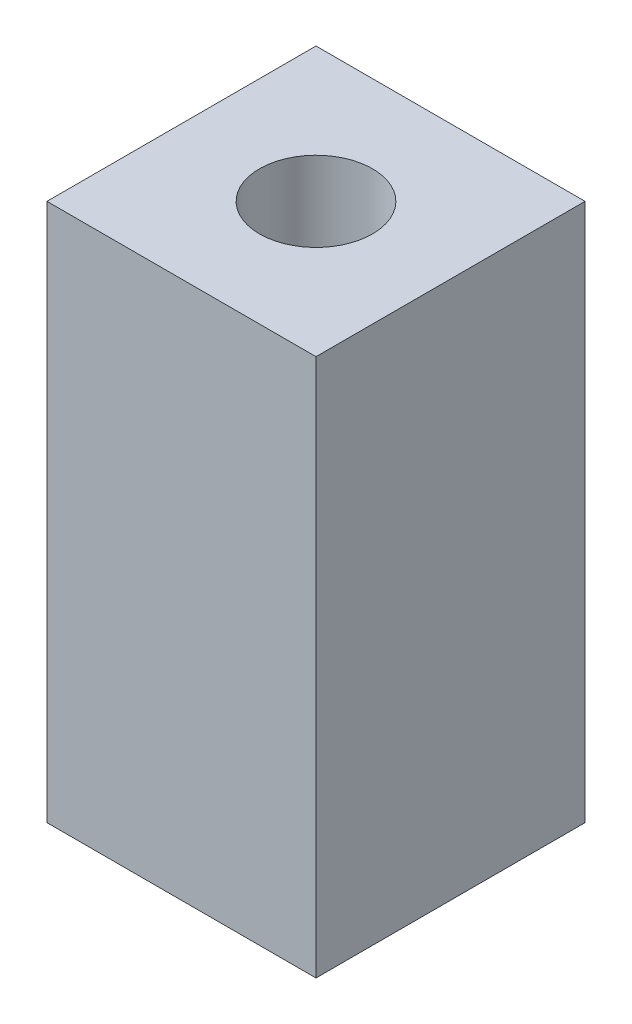
ISO-10303-21;
HEADER;
FILE_DESCRIPTION(('STEP AP214'),'2;1');
FILE_NAME('part.step','',(''),(''),'','','');
FILE_SCHEMA(('AUTOMOTIVE_DESIGN { 1 0 10303 214 1 1 1 1 }'));
ENDSEC;
DATA;
#1=APPLICATION_CONTEXT('core data for automotive mechanical design processes');
#2=APPLICATION_PROTOCOL_DEFINITION('international standard','automotive_design',2000,#1);
#3=PRODUCT_CONTEXT('',#1,'mechanical');
#4=PRODUCT('Part','Part','',(#3));
#5=PRODUCT_RELATED_PRODUCT_CATEGORY('part','',(#4));
#6=PRODUCT_DEFINITION_FORMATION('','',#4);
#7=PRODUCT_DEFINITION_CONTEXT('part definition',#1,'design');
#8=PRODUCT_DEFINITION('design','',#6,#7);
#9=PRODUCT_DEFINITION_SHAPE('','',#8);
#10=(LENGTH_UNIT() NAMED_UNIT(*) SI_UNIT(.MILLI.,.METRE.));
#11=(NAMED_UNIT(*) PLANE_ANGLE_UNIT() SI_UNIT($,.RADIAN.));
#12=(NAMED_UNIT(*) SI_UNIT($,.STERADIAN.) SOLID_ANGLE_UNIT());
#13=UNCERTAINTY_MEASURE_WITH_UNIT(LENGTH_MEASURE(1.E-05),#10,'distance_accuracy_value','');
#14=(GEOMETRIC_REPRESENTATION_CONTEXT(3) GLOBAL_UNCERTAINTY_ASSIGNED_CONTEXT((#13)) GLOBAL_UNIT_ASSIGNED_CONTEXT((#10,
#11,#12)) REPRESENTATION_CONTEXT('',''));
#15=CARTESIAN_POINT('',(0.,0.,0.));
#16=DIRECTION('',(0.,0.,1.));
#17=DIRECTION('',(1.,0.,0.));
#18=AXIS2_PLACEMENT_3D('',#15,#16,#17);
#19=CARTESIAN_POINT('',(-2.5,5.,2.5));
#20=DIRECTION('',(1.,0.,0.));
#21=DIRECTION('',(0.,0.,-1.));
#22=AXIS2_PLACEMENT_3D('',#19,#20,#21);
#23=PLANE('',#22);
#24=DIRECTION('',(0.,0.,1.));
#25=VECTOR('',#24,1.);
#26=CARTESIAN_POINT('',(-2.5,-5.,2.5));
#27=LINE('',#26,#25);
#28=CARTESIAN_POINT('',(-2.5,-5.,-2.5));
#29=VERTEX_POINT('',#28);
#30=CARTESIAN_POINT('',(-2.5,-5.,2.5));
#31=VERTEX_POINT('',#30);
#32=EDGE_CURVE('E96',#29,#31,#27,.T.);
#33=ORIENTED_EDGE('',*,*,#32,.T.);
#34=DIRECTION('',(0.,-1.,0.));
#35=VECTOR('',#34,1.);
#36=CARTESIAN_POINT('',(-2.5,5.,2.5));
#37=LINE('',#36,#35);
#38=CARTESIAN_POINT('',(-2.5,5.,2.5));
#39=VERTEX_POINT('',#38);
#40=EDGE_CURVE('E11',#39,#31,#37,.T.);
#41=ORIENTED_EDGE('',*,*,#40,.F.);
#42=DIRECTION('',(0.,0.,1.));
#43=VECTOR('',#42,1.);
#44=CARTESIAN_POINT('',(-2.5,5.,2.5));
#45=LINE('',#44,#43);
#46=CARTESIAN_POINT('',(-2.5,5.,-2.5));
#47=VERTEX_POINT('',#46);
#48=EDGE_CURVE('E84',#47,#39,#45,.T.);
#49=ORIENTED_EDGE('',*,*,#48,.F.);
#50=DIRECTION('',(0.,-1.,0.));
#51=VECTOR('',#50,1.);
#52=CARTESIAN_POINT('',(-2.5,5.,-2.5));
#53=LINE('',#52,#51);
#54=EDGE_CURVE('E92',#47,#29,#53,.T.);
#55=ORIENTED_EDGE('',*,*,#54,.T.);
#56=EDGE_LOOP('',(#33,#41,#49,#55));
#57=FACE_BOUND('',#56,.T.);
#58=ADVANCED_FACE('F33',(#57),#23,.F.);
#59=CARTESIAN_POINT('',(2.5,5.,2.5));
#60=DIRECTION('',(0.,0.,-1.));
#61=DIRECTION('',(-1.,0.,0.));
#62=AXIS2_PLACEMENT_3D('',#59,#60,#61);
#63=PLANE('',#62);
#64=DIRECTION('',(1.,0.,0.));
#65=VECTOR('',#64,1.);
#66=CARTESIAN_POINT('',(2.5,-5.,2.5));
#67=LINE('',#66,#65);
#68=CARTESIAN_POINT('',(2.5,-5.,2.5));
#69=VERTEX_POINT('',#68);
#70=EDGE_CURVE('E88',#31,#69,#67,.T.);
#71=ORIENTED_EDGE('',*,*,#70,.T.);
#72=DIRECTION('',(0.,-1.,0.));
#73=VECTOR('',#72,1.);
#74=CARTESIAN_POINT('',(2.5,5.,2.5));
#75=LINE('',#74,#73);
#76=CARTESIAN_POINT('',(2.5,5.,2.5));
#77=VERTEX_POINT('',#76);
#78=EDGE_CURVE('E41',#77,#69,#75,.T.);
#79=ORIENTED_EDGE('',*,*,#78,.F.);
#80=DIRECTION('',(1.,0.,0.));
#81=VECTOR('',#80,1.);
#82=CARTESIAN_POINT('',(2.5,5.,2.5));
#83=LINE('',#82,#81);
#84=EDGE_CURVE('E79',#39,#77,#83,.T.);
#85=ORIENTED_EDGE('',*,*,#84,.F.);
#86=ORIENTED_EDGE('',*,*,#40,.T.);
#87=EDGE_LOOP('',(#71,#79,#85,#86));
#88=FACE_BOUND('',#87,.T.);
#89=ADVANCED_FACE('F87',(#88),#63,.F.);
#90=CARTESIAN_POINT('',(2.5,5.,2.5));
#91=DIRECTION('',(-1.,0.,0.));
#92=DIRECTION('',(0.,0.,1.));
#93=AXIS2_PLACEMENT_3D('',#90,#91,#92);
#94=PLANE('',#93);
#95=DIRECTION('',(0.,0.,-1.));
#96=VECTOR('',#95,1.);
#97=CARTESIAN_POINT('',(2.5,-5.,2.5));
#98=LINE('',#97,#96);
#99=CARTESIAN_POINT('',(2.5,-5.,-2.5));
#100=VERTEX_POINT('',#99);
#101=EDGE_CURVE('E66',#69,#100,#98,.T.);
#102=ORIENTED_EDGE('',*,*,#101,.T.);
#103=DIRECTION('',(0.,-1.,0.));
#104=VECTOR('',#103,1.);
#105=CARTESIAN_POINT('',(2.5,5.,-2.5));
#106=LINE('',#105,#104);
#107=CARTESIAN_POINT('',(2.5,5.,-2.5));
#108=VERTEX_POINT('',#107);
#109=EDGE_CURVE('E89',#108,#100,#106,.T.);
#110=ORIENTED_EDGE('',*,*,#109,.F.);
#111=DIRECTION('',(0.,0.,-1.));
#112=VECTOR('',#111,1.);
#113=CARTESIAN_POINT('',(2.5,5.,2.5));
#114=LINE('',#113,#112);
#115=EDGE_CURVE('E82',#77,#108,#114,.T.);
#116=ORIENTED_EDGE('',*,*,#115,.F.);
#117=ORIENTED_EDGE('',*,*,#78,.T.);
#118=EDGE_LOOP('',(#102,#110,#116,#117));
#119=FACE_BOUND('',#118,.T.);
#120=ADVANCED_FACE('F90',(#119),#94,.F.);
#121=CARTESIAN_POINT('',(2.5,5.,-2.5));
#122=DIRECTION('',(0.,0.,1.));
#123=DIRECTION('',(1.,0.,0.));
#124=AXIS2_PLACEMENT_3D('',#121,#122,#123);
#125=PLANE('',#124);
#126=DIRECTION('',(-1.,0.,0.));
#127=VECTOR('',#126,1.);
#128=CARTESIAN_POINT('',(2.5,-5.,-2.5));
#129=LINE('',#128,#127);
#130=EDGE_CURVE('E72',#100,#29,#129,.T.);
#131=ORIENTED_EDGE('',*,*,#130,.T.);
#132=ORIENTED_EDGE('',*,*,#54,.F.);
#133=DIRECTION('',(-1.,0.,0.));
#134=VECTOR('',#133,1.);
#135=CARTESIAN_POINT('',(2.5,5.,-2.5));
#136=LINE('',#135,#134);
#137=EDGE_CURVE('E49',#108,#47,#136,.T.);
#138=ORIENTED_EDGE('',*,*,#137,.F.);
#139=ORIENTED_EDGE('',*,*,#109,.T.);
#140=EDGE_LOOP('',(#131,#132,#138,#139));
#141=FACE_BOUND('',#140,.T.);
#142=ADVANCED_FACE('F104',(#141),#125,.F.);
#143=CARTESIAN_POINT('',(0.,5.,0.));
#144=DIRECTION('',(0.,1.,0.));
#145=DIRECTION('',(0.,0.,1.));
#146=AXIS2_PLACEMENT_3D('',#143,#144,#145);
#147=PLANE('',#146);
#148=CARTESIAN_POINT('',(0.,5.,0.));
#149=DIRECTION('',(0.,1.,0.));
#150=DIRECTION('',(0.,0.,1.));
#151=AXIS2_PLACEMENT_3D('',#148,#149,#150);
#152=CIRCLE('',#151,1.05);
#153=CARTESIAN_POINT('',(0.,5.,1.05));
#154=VERTEX_POINT('',#153);
#155=EDGE_CURVE('E110',#154,#154,#152,.T.);
#156=ORIENTED_EDGE('',*,*,#155,.F.);
#157=EDGE_LOOP('',(#156));
#158=FACE_BOUND('',#157,.T.);
#159=ORIENTED_EDGE('',*,*,#48,.T.);
#160=ORIENTED_EDGE('',*,*,#84,.T.);
#161=ORIENTED_EDGE('',*,*,#115,.T.);
#162=ORIENTED_EDGE('',*,*,#137,.T.);
#163=EDGE_LOOP('',(#159,#160,#161,#162));
#164=FACE_BOUND('',#163,.T.);
#165=ADVANCED_FACE('F80',(#158,#164),#147,.T.);
#166=CARTESIAN_POINT('',(0.,-5.,0.));
#167=DIRECTION('',(0.,1.,0.));
#168=DIRECTION('',(0.,0.,1.));
#169=AXIS2_PLACEMENT_3D('',#166,#167,#168);
#170=PLANE('',#169);
#171=CARTESIAN_POINT('',(0.,-5.,0.));
#172=DIRECTION('',(0.,-1.,0.));
#173=DIRECTION('',(0.,0.,-1.));
#174=AXIS2_PLACEMENT_3D('',#171,#172,#173);
#175=CIRCLE('',#174,1.05);
#176=CARTESIAN_POINT('',(0.,-5.,-1.05));
#177=VERTEX_POINT('',#176);
#178=EDGE_CURVE('E116',#177,#177,#175,.T.);
#179=ORIENTED_EDGE('',*,*,#178,.F.);
#180=EDGE_LOOP('',(#179));
#181=FACE_BOUND('',#180,.T.);
#182=ORIENTED_EDGE('',*,*,#32,.F.);
#183=ORIENTED_EDGE('',*,*,#130,.F.);
#184=ORIENTED_EDGE('',*,*,#101,.F.);
#185=ORIENTED_EDGE('',*,*,#70,.F.);
#186=EDGE_LOOP('',(#182,#183,#184,#185));
#187=FACE_BOUND('',#186,.T.);
#188=ADVANCED_FACE('F107',(#181,#187),#170,.F.);
#189=CARTESIAN_POINT('',(0.,2.,0.));
#190=DIRECTION('',(0.,1.,0.));
#191=DIRECTION('',(0.,0.,1.));
#192=AXIS2_PLACEMENT_3D('',#189,#190,#191);
#193=CYLINDRICAL_SURFACE('',#192,1.05);
#194=CARTESIAN_POINT('',(0.,2.,0.));
#195=DIRECTION('',(0.,1.,0.));
#196=DIRECTION('',(0.,0.,1.));
#197=AXIS2_PLACEMENT_3D('',#194,#195,#196);
#198=CIRCLE('',#197,1.05);
#199=CARTESIAN_POINT('',(0.,2.,1.05));
#200=VERTEX_POINT('',#199);
#201=EDGE_CURVE('E99',#200,#200,#198,.T.);
#202=ORIENTED_EDGE('',*,*,#201,.F.);
#203=EDGE_LOOP('',(#202));
#204=FACE_BOUND('',#203,.T.);
#205=ORIENTED_EDGE('',*,*,#155,.T.);
#206=EDGE_LOOP('',(#205));
#207=FACE_BOUND('',#206,.T.);
#208=ADVANCED_FACE('F132',(#204,#207),#193,.F.);
#209=CARTESIAN_POINT('',(0.,2.,0.));
#210=DIRECTION('',(0.,1.,0.));
#211=DIRECTION('',(0.,0.,1.));
#212=AXIS2_PLACEMENT_3D('',#209,#210,#211);
#213=PLANE('',#212);
#214=ORIENTED_EDGE('',*,*,#201,.T.);
#215=EDGE_LOOP('',(#214));
#216=FACE_BOUND('',#215,.T.);
#217=ADVANCED_FACE('F127',(#216),#213,.T.);
#218=CARTESIAN_POINT('',(0.,-2.,0.));
#219=DIRECTION('',(0.,-1.,0.));
#220=DIRECTION('',(0.,0.,-1.));
#221=AXIS2_PLACEMENT_3D('',#218,#219,#220);
#222=CYLINDRICAL_SURFACE('',#221,1.05);
#223=CARTESIAN_POINT('',(0.,-2.,0.));
#224=DIRECTION('',(0.,-1.,0.));
#225=DIRECTION('',(0.,0.,-1.));
#226=AXIS2_PLACEMENT_3D('',#223,#224,#225);
#227=CIRCLE('',#226,1.05);
#228=CARTESIAN_POINT('',(0.,-2.,-1.05));
#229=VERTEX_POINT('',#228);
#230=EDGE_CURVE('E113',#229,#229,#227,.T.);
#231=ORIENTED_EDGE('',*,*,#230,.F.);
#232=EDGE_LOOP('',(#231));
#233=FACE_BOUND('',#232,.T.);
#234=ORIENTED_EDGE('',*,*,#178,.T.);
#235=EDGE_LOOP('',(#234));
#236=FACE_BOUND('',#235,.T.);
#237=ADVANCED_FACE('F124',(#233,#236),#222,.F.);
#238=CARTESIAN_POINT('',(0.,-2.,0.));
#239=DIRECTION('',(0.,-1.,0.));
#240=DIRECTION('',(0.,0.,-1.));
#241=AXIS2_PLACEMENT_3D('',#238,#239,#240);
#242=PLANE('',#241);
#243=ORIENTED_EDGE('',*,*,#230,.T.);
#244=EDGE_LOOP('',(#243));
#245=FACE_BOUND('',#244,.T.);
#246=ADVANCED_FACE('F122',(#245),#242,.T.);
#247=CLOSED_SHELL('',(#58,#89,#120,#142,#165,#188,#208,#217,#237,#246));
#248=MANIFOLD_SOLID_BREP('B2',#247);
#249=ADVANCED_BREP_SHAPE_REPRESENTATION('',(#18,#248),#14);
#250=SHAPE_DEFINITION_REPRESENTATION(#9,#249);
ENDSEC;
END-ISO-10303-21;
